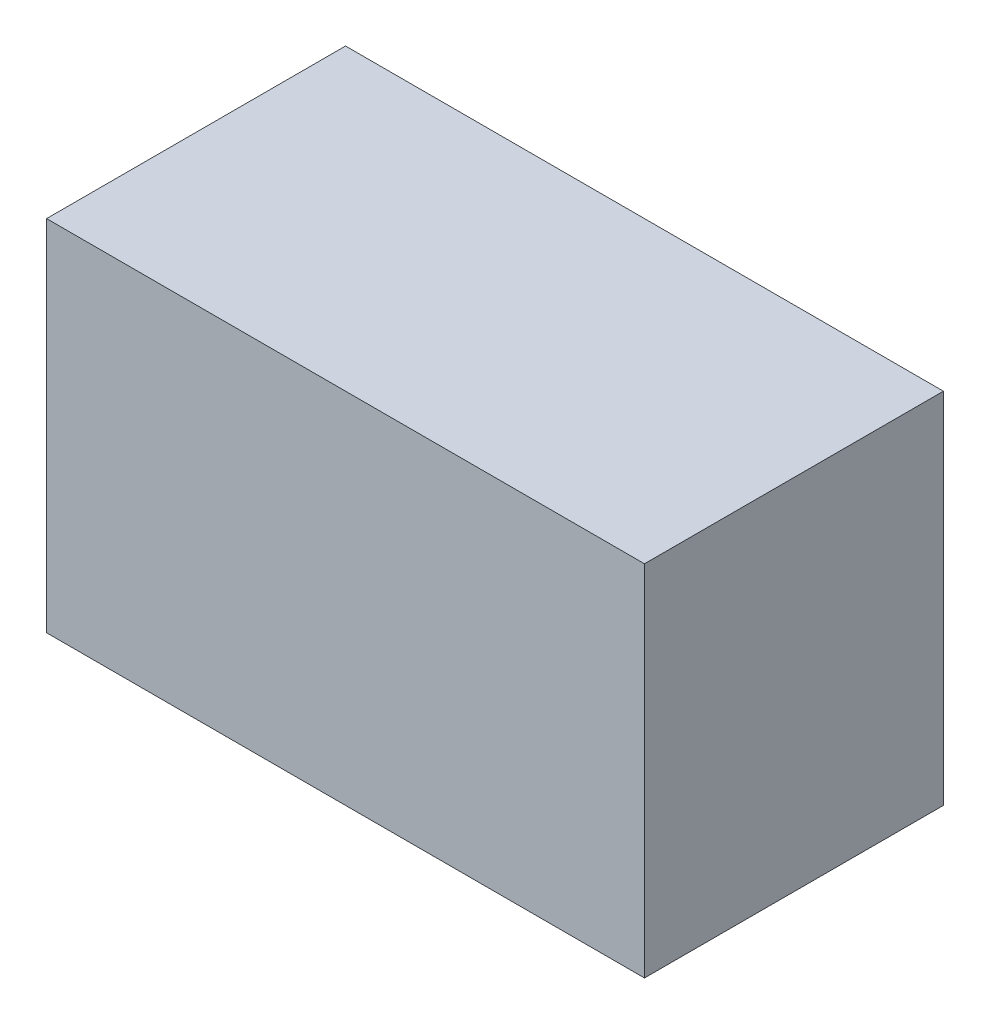
ISO-10303-21;
HEADER;
FILE_DESCRIPTION(('STEP AP214'),'2;1');
FILE_NAME('part.step','',(''),(''),'','','');
FILE_SCHEMA(('AUTOMOTIVE_DESIGN { 1 0 10303 214 1 1 1 1 }'));
ENDSEC;
DATA;
#1=APPLICATION_CONTEXT('core data for automotive mechanical design processes');
#2=APPLICATION_PROTOCOL_DEFINITION('international standard','automotive_design',2000,#1);
#3=PRODUCT_CONTEXT('',#1,'mechanical');
#4=PRODUCT('Part','Part','',(#3));
#5=PRODUCT_RELATED_PRODUCT_CATEGORY('part','',(#4));
#6=PRODUCT_DEFINITION_FORMATION('','',#4);
#7=PRODUCT_DEFINITION_CONTEXT('part definition',#1,'design');
#8=PRODUCT_DEFINITION('design','',#6,#7);
#9=PRODUCT_DEFINITION_SHAPE('','',#8);
#10=(LENGTH_UNIT() NAMED_UNIT(*) SI_UNIT(.MILLI.,.METRE.));
#11=(NAMED_UNIT(*) PLANE_ANGLE_UNIT() SI_UNIT($,.RADIAN.));
#12=(NAMED_UNIT(*) SI_UNIT($,.STERADIAN.) SOLID_ANGLE_UNIT());
#13=UNCERTAINTY_MEASURE_WITH_UNIT(LENGTH_MEASURE(1.E-05),#10,'distance_accuracy_value','');
#14=(GEOMETRIC_REPRESENTATION_CONTEXT(3) GLOBAL_UNCERTAINTY_ASSIGNED_CONTEXT((#13)) GLOBAL_UNIT_ASSIGNED_CONTEXT((#10,
#11,#12)) REPRESENTATION_CONTEXT('',''));
#15=CARTESIAN_POINT('',(0.,0.,0.));
#16=DIRECTION('',(0.,0.,1.));
#17=DIRECTION('',(1.,0.,0.));
#18=AXIS2_PLACEMENT_3D('',#15,#16,#17);
#19=CARTESIAN_POINT('',(0.,0.,50.));
#20=DIRECTION('',(1.,0.,0.));
#21=DIRECTION('',(0.,0.,-1.));
#22=AXIS2_PLACEMENT_3D('',#19,#20,#21);
#23=PLANE('',#22);
#24=DIRECTION('',(0.,-1.,0.));
#25=VECTOR('',#24,1.);
#26=CARTESIAN_POINT('',(0.,0.,0.));
#27=LINE('',#26,#25);
#28=CARTESIAN_POINT('',(0.,60.,0.));
#29=VERTEX_POINT('',#28);
#30=CARTESIAN_POINT('',(0.,0.,0.));
#31=VERTEX_POINT('',#30);
#32=EDGE_CURVE('E98',#29,#31,#27,.T.);
#33=ORIENTED_EDGE('',*,*,#32,.T.);
#34=DIRECTION('',(0.,0.,-1.));
#35=VECTOR('',#34,1.);
#36=CARTESIAN_POINT('',(0.,0.,50.));
#37=LINE('',#36,#35);
#38=CARTESIAN_POINT('',(0.,0.,50.));
#39=VERTEX_POINT('',#38);
#40=EDGE_CURVE('E11',#39,#31,#37,.T.);
#41=ORIENTED_EDGE('',*,*,#40,.F.);
#42=DIRECTION('',(0.,-1.,0.));
#43=VECTOR('',#42,1.);
#44=CARTESIAN_POINT('',(0.,0.,50.));
#45=LINE('',#44,#43);
#46=CARTESIAN_POINT('',(0.,60.,50.));
#47=VERTEX_POINT('',#46);
#48=EDGE_CURVE('E86',#47,#39,#45,.T.);
#49=ORIENTED_EDGE('',*,*,#48,.F.);
#50=DIRECTION('',(0.,0.,-1.));
#51=VECTOR('',#50,1.);
#52=CARTESIAN_POINT('',(0.,60.,50.));
#53=LINE('',#52,#51);
#54=EDGE_CURVE('E94',#47,#29,#53,.T.);
#55=ORIENTED_EDGE('',*,*,#54,.T.);
#56=EDGE_LOOP('',(#33,#41,#49,#55));
#57=FACE_BOUND('',#56,.T.);
#58=ADVANCED_FACE('F35',(#57),#23,.F.);
#59=CARTESIAN_POINT('',(0.,0.,50.));
#60=DIRECTION('',(0.,1.,0.));
#61=DIRECTION('',(0.,0.,1.));
#62=AXIS2_PLACEMENT_3D('',#59,#60,#61);
#63=PLANE('',#62);
#64=DIRECTION('',(1.,0.,0.));
#65=VECTOR('',#64,1.);
#66=CARTESIAN_POINT('',(0.,0.,0.));
#67=LINE('',#66,#65);
#68=CARTESIAN_POINT('',(100.,0.,0.));
#69=VERTEX_POINT('',#68);
#70=EDGE_CURVE('E90',#31,#69,#67,.T.);
#71=ORIENTED_EDGE('',*,*,#70,.T.);
#72=DIRECTION('',(0.,0.,-1.));
#73=VECTOR('',#72,1.);
#74=CARTESIAN_POINT('',(100.,0.,50.));
#75=LINE('',#74,#73);
#76=CARTESIAN_POINT('',(100.,0.,50.));
#77=VERTEX_POINT('',#76);
#78=EDGE_CURVE('E43',#77,#69,#75,.T.);
#79=ORIENTED_EDGE('',*,*,#78,.F.);
#80=DIRECTION('',(1.,0.,0.));
#81=VECTOR('',#80,1.);
#82=CARTESIAN_POINT('',(0.,0.,50.));
#83=LINE('',#82,#81);
#84=EDGE_CURVE('E81',#39,#77,#83,.T.);
#85=ORIENTED_EDGE('',*,*,#84,.F.);
#86=ORIENTED_EDGE('',*,*,#40,.T.);
#87=EDGE_LOOP('',(#71,#79,#85,#86));
#88=FACE_BOUND('',#87,.T.);
#89=ADVANCED_FACE('F89',(#88),#63,.F.);
#90=CARTESIAN_POINT('',(100.,0.,50.));
#91=DIRECTION('',(-1.,0.,0.));
#92=DIRECTION('',(0.,0.,1.));
#93=AXIS2_PLACEMENT_3D('',#90,#91,#92);
#94=PLANE('',#93);
#95=DIRECTION('',(0.,1.,0.));
#96=VECTOR('',#95,1.);
#97=CARTESIAN_POINT('',(100.,0.,0.));
#98=LINE('',#97,#96);
#99=CARTESIAN_POINT('',(100.,60.,0.));
#100=VERTEX_POINT('',#99);
#101=EDGE_CURVE('E68',#69,#100,#98,.T.);
#102=ORIENTED_EDGE('',*,*,#101,.T.);
#103=DIRECTION('',(0.,0.,-1.));
#104=VECTOR('',#103,1.);
#105=CARTESIAN_POINT('',(100.,60.,50.));
#106=LINE('',#105,#104);
#107=CARTESIAN_POINT('',(100.,60.,50.));
#108=VERTEX_POINT('',#107);
#109=EDGE_CURVE('E91',#108,#100,#106,.T.);
#110=ORIENTED_EDGE('',*,*,#109,.F.);
#111=DIRECTION('',(0.,1.,0.));
#112=VECTOR('',#111,1.);
#113=CARTESIAN_POINT('',(100.,0.,50.));
#114=LINE('',#113,#112);
#115=EDGE_CURVE('E84',#77,#108,#114,.T.);
#116=ORIENTED_EDGE('',*,*,#115,.F.);
#117=ORIENTED_EDGE('',*,*,#78,.T.);
#118=EDGE_LOOP('',(#102,#110,#116,#117));
#119=FACE_BOUND('',#118,.T.);
#120=ADVANCED_FACE('F92',(#119),#94,.F.);
#121=CARTESIAN_POINT('',(0.,60.,50.));
#122=DIRECTION('',(0.,-1.,0.));
#123=DIRECTION('',(0.,0.,-1.));
#124=AXIS2_PLACEMENT_3D('',#121,#122,#123);
#125=PLANE('',#124);
#126=DIRECTION('',(-1.,0.,0.));
#127=VECTOR('',#126,1.);
#128=CARTESIAN_POINT('',(0.,60.,0.));
#129=LINE('',#128,#127);
#130=EDGE_CURVE('E74',#100,#29,#129,.T.);
#131=ORIENTED_EDGE('',*,*,#130,.T.);
#132=ORIENTED_EDGE('',*,*,#54,.F.);
#133=DIRECTION('',(-1.,0.,0.));
#134=VECTOR('',#133,1.);
#135=CARTESIAN_POINT('',(0.,60.,50.));
#136=LINE('',#135,#134);
#137=EDGE_CURVE('E51',#108,#47,#136,.T.);
#138=ORIENTED_EDGE('',*,*,#137,.F.);
#139=ORIENTED_EDGE('',*,*,#109,.T.);
#140=EDGE_LOOP('',(#131,#132,#138,#139));
#141=FACE_BOUND('',#140,.T.);
#142=ADVANCED_FACE('F105',(#141),#125,.F.);
#143=CARTESIAN_POINT('',(0.,0.,50.));
#144=DIRECTION('',(0.,0.,-1.));
#145=DIRECTION('',(-1.,0.,0.));
#146=AXIS2_PLACEMENT_3D('',#143,#144,#145);
#147=PLANE('',#146);
#148=ORIENTED_EDGE('',*,*,#48,.T.);
#149=ORIENTED_EDGE('',*,*,#84,.T.);
#150=ORIENTED_EDGE('',*,*,#115,.T.);
#151=ORIENTED_EDGE('',*,*,#137,.T.);
#152=EDGE_LOOP('',(#148,#149,#150,#151));
#153=FACE_BOUND('',#152,.T.);
#154=ADVANCED_FACE('F82',(#153),#147,.F.);
#155=CARTESIAN_POINT('',(0.,0.,0.));
#156=DIRECTION('',(0.,0.,-1.));
#157=DIRECTION('',(-1.,0.,0.));
#158=AXIS2_PLACEMENT_3D('',#155,#156,#157);
#159=PLANE('',#158);
#160=ORIENTED_EDGE('',*,*,#32,.F.);
#161=ORIENTED_EDGE('',*,*,#130,.F.);
#162=ORIENTED_EDGE('',*,*,#101,.F.);
#163=ORIENTED_EDGE('',*,*,#70,.F.);
#164=EDGE_LOOP('',(#160,#161,#162,#163));
#165=FACE_BOUND('',#164,.T.);
#166=ADVANCED_FACE('F108',(#165),#159,.T.);
#167=CLOSED_SHELL('',(#58,#89,#120,#142,#154,#166));
#168=MANIFOLD_SOLID_BREP('B2',#167);
#169=ADVANCED_BREP_SHAPE_REPRESENTATION('',(#18,#168),#14);
#170=SHAPE_DEFINITION_REPRESENTATION(#9,#169);
ENDSEC;
END-ISO-10303-21;
